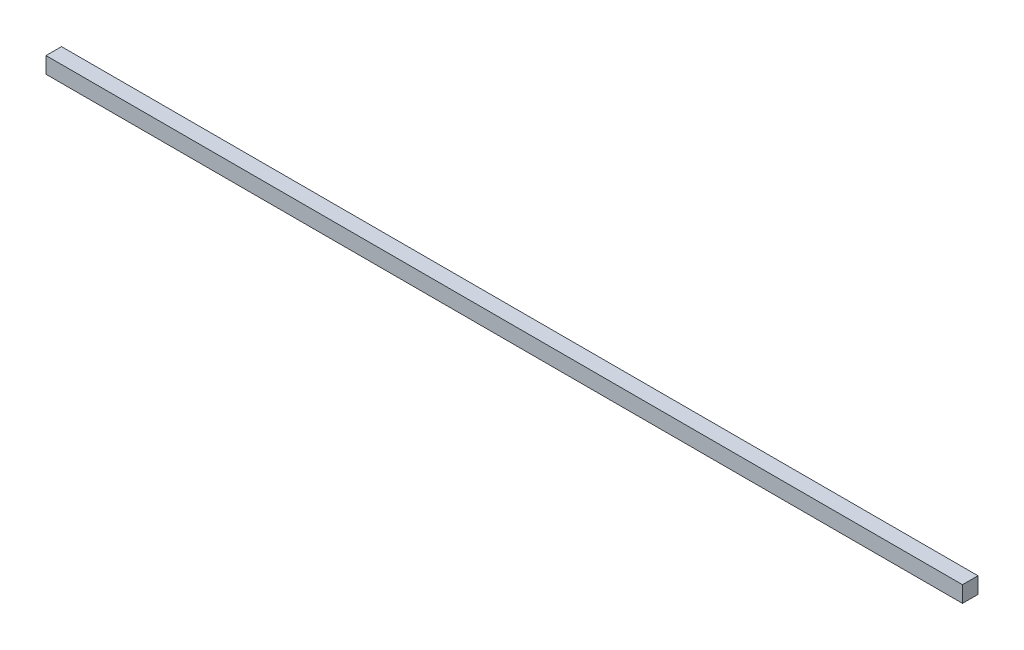
ISO-10303-21;
HEADER;
FILE_DESCRIPTION(('STEP AP214'),'2;1');
FILE_NAME('part.step','',(''),(''),'','','');
FILE_SCHEMA(('AUTOMOTIVE_DESIGN { 1 0 10303 214 1 1 1 1 }'));
ENDSEC;
DATA;
#1=APPLICATION_CONTEXT('core data for automotive mechanical design processes');
#2=APPLICATION_PROTOCOL_DEFINITION('international standard','automotive_design',2000,#1);
#3=PRODUCT_CONTEXT('',#1,'mechanical');
#4=PRODUCT('Part','Part','',(#3));
#5=PRODUCT_RELATED_PRODUCT_CATEGORY('part','',(#4));
#6=PRODUCT_DEFINITION_FORMATION('','',#4);
#7=PRODUCT_DEFINITION_CONTEXT('part definition',#1,'design');
#8=PRODUCT_DEFINITION('design','',#6,#7);
#9=PRODUCT_DEFINITION_SHAPE('','',#8);
#10=(LENGTH_UNIT() NAMED_UNIT(*) SI_UNIT(.MILLI.,.METRE.));
#11=(NAMED_UNIT(*) PLANE_ANGLE_UNIT() SI_UNIT($,.RADIAN.));
#12=(NAMED_UNIT(*) SI_UNIT($,.STERADIAN.) SOLID_ANGLE_UNIT());
#13=UNCERTAINTY_MEASURE_WITH_UNIT(LENGTH_MEASURE(1.E-05),#10,'distance_accuracy_value','');
#14=(GEOMETRIC_REPRESENTATION_CONTEXT(3) GLOBAL_UNCERTAINTY_ASSIGNED_CONTEXT((#13)) GLOBAL_UNIT_ASSIGNED_CONTEXT((#10,
#11,#12)) REPRESENTATION_CONTEXT('',''));
#15=CARTESIAN_POINT('',(0.,0.,0.));
#16=DIRECTION('',(0.,0.,1.));
#17=DIRECTION('',(1.,0.,0.));
#18=AXIS2_PLACEMENT_3D('',#15,#16,#17);
#19=CARTESIAN_POINT('',(-47.0387096774194,4.5258064516129,22.));
#20=DIRECTION('',(1.,0.,0.));
#21=DIRECTION('',(0.,0.,-1.));
#22=AXIS2_PLACEMENT_3D('',#19,#20,#21);
#23=PLANE('',#22);
#24=DIRECTION('',(0.,-1.,0.));
#25=VECTOR('',#24,1.);
#26=CARTESIAN_POINT('',(-47.0387096774194,4.5258064516129,0.));
#27=LINE('',#26,#25);
#28=CARTESIAN_POINT('',(-47.0387096774194,4.5258064516129,0.));
#29=VERTEX_POINT('',#28);
#30=CARTESIAN_POINT('',(-47.0387096774194,-18.4741935483871,0.));
#31=VERTEX_POINT('',#30);
#32=EDGE_CURVE('E113',#29,#31,#27,.T.);
#33=ORIENTED_EDGE('',*,*,#32,.T.);
#34=DIRECTION('',(0.,0.,-1.));
#35=VECTOR('',#34,1.);
#36=CARTESIAN_POINT('',(-47.0387096774194,-18.4741935483871,22.));
#37=LINE('',#36,#35);
#38=CARTESIAN_POINT('',(-47.0387096774194,-18.4741935483871,22.));
#39=VERTEX_POINT('',#38);
#40=EDGE_CURVE('E11',#39,#31,#37,.T.);
#41=ORIENTED_EDGE('',*,*,#40,.F.);
#42=DIRECTION('',(0.,-1.,0.));
#43=VECTOR('',#42,1.);
#44=CARTESIAN_POINT('',(-47.0387096774194,4.5258064516129,22.));
#45=LINE('',#44,#43);
#46=CARTESIAN_POINT('',(-47.0387096774194,4.5258064516129,22.));
#47=VERTEX_POINT('',#46);
#48=EDGE_CURVE('E97',#47,#39,#45,.T.);
#49=ORIENTED_EDGE('',*,*,#48,.F.);
#50=DIRECTION('',(0.,0.,-1.));
#51=VECTOR('',#50,1.);
#52=CARTESIAN_POINT('',(-47.0387096774194,4.5258064516129,22.));
#53=LINE('',#52,#51);
#54=EDGE_CURVE('E109',#47,#29,#53,.T.);
#55=ORIENTED_EDGE('',*,*,#54,.T.);
#56=EDGE_LOOP('',(#33,#41,#49,#55));
#57=FACE_BOUND('',#56,.T.);
#58=ADVANCED_FACE('F45',(#57),#23,.F.);
#59=CARTESIAN_POINT('',(-47.0387096774194,-18.4741935483871,22.));
#60=DIRECTION('',(0.,1.,0.));
#61=DIRECTION('',(-1.,0.,0.));
#62=AXIS2_PLACEMENT_3D('',#59,#60,#61);
#63=PLANE('',#62);
#64=DIRECTION('',(1.,0.,0.));
#65=VECTOR('',#64,1.);
#66=CARTESIAN_POINT('',(-47.0387096774194,-18.4741935483871,0.));
#67=LINE('',#66,#65);
#68=CARTESIAN_POINT('',(1252.96129032258,-18.4741935483871,0.));
#69=VERTEX_POINT('',#68);
#70=EDGE_CURVE('E102',#31,#69,#67,.T.);
#71=ORIENTED_EDGE('',*,*,#70,.T.);
#72=DIRECTION('',(0.,0.,-1.));
#73=VECTOR('',#72,1.);
#74=CARTESIAN_POINT('',(1252.96129032258,-18.4741935483871,22.));
#75=LINE('',#74,#73);
#76=CARTESIAN_POINT('',(1252.96129032258,-18.4741935483871,22.));
#77=VERTEX_POINT('',#76);
#78=EDGE_CURVE('E54',#77,#69,#75,.T.);
#79=ORIENTED_EDGE('',*,*,#78,.F.);
#80=DIRECTION('',(1.,0.,0.));
#81=VECTOR('',#80,1.);
#82=CARTESIAN_POINT('',(-47.0387096774194,-18.4741935483871,22.));
#83=LINE('',#82,#81);
#84=EDGE_CURVE('E92',#39,#77,#83,.T.);
#85=ORIENTED_EDGE('',*,*,#84,.F.);
#86=ORIENTED_EDGE('',*,*,#40,.T.);
#87=EDGE_LOOP('',(#71,#79,#85,#86));
#88=FACE_BOUND('',#87,.T.);
#89=ADVANCED_FACE('F101',(#88),#63,.F.);
#90=CARTESIAN_POINT('',(1252.96129032258,4.5258064516129,22.));
#91=DIRECTION('',(-1.,0.,0.));
#92=DIRECTION('',(0.,0.,1.));
#93=AXIS2_PLACEMENT_3D('',#90,#91,#92);
#94=PLANE('',#93);
#95=DIRECTION('',(0.,1.,0.));
#96=VECTOR('',#95,1.);
#97=CARTESIAN_POINT('',(1252.96129032258,4.5258064516129,0.));
#98=LINE('',#97,#96);
#99=CARTESIAN_POINT('',(1252.96129032258,4.5258064516129,0.));
#100=VERTEX_POINT('',#99);
#101=EDGE_CURVE('E79',#69,#100,#98,.T.);
#102=ORIENTED_EDGE('',*,*,#101,.T.);
#103=DIRECTION('',(0.,0.,-1.));
#104=VECTOR('',#103,1.);
#105=CARTESIAN_POINT('',(1252.96129032258,4.5258064516129,22.));
#106=LINE('',#105,#104);
#107=CARTESIAN_POINT('',(1252.96129032258,4.5258064516129,22.));
#108=VERTEX_POINT('',#107);
#109=EDGE_CURVE('E104',#108,#100,#106,.T.);
#110=ORIENTED_EDGE('',*,*,#109,.F.);
#111=DIRECTION('',(0.,1.,0.));
#112=VECTOR('',#111,1.);
#113=CARTESIAN_POINT('',(1252.96129032258,4.5258064516129,22.));
#114=LINE('',#113,#112);
#115=EDGE_CURVE('E95',#77,#108,#114,.T.);
#116=ORIENTED_EDGE('',*,*,#115,.F.);
#117=ORIENTED_EDGE('',*,*,#78,.T.);
#118=EDGE_LOOP('',(#102,#110,#116,#117));
#119=FACE_BOUND('',#118,.T.);
#120=ADVANCED_FACE('F105',(#119),#94,.F.);
#121=CARTESIAN_POINT('',(-47.0387096774194,4.5258064516129,22.));
#122=DIRECTION('',(0.,-1.,0.));
#123=DIRECTION('',(0.,0.,-1.));
#124=AXIS2_PLACEMENT_3D('',#121,#122,#123);
#125=PLANE('',#124);
#126=DIRECTION('',(-1.,0.,0.));
#127=VECTOR('',#126,1.);
#128=CARTESIAN_POINT('',(-47.0387096774194,4.5258064516129,0.));
#129=LINE('',#128,#127);
#130=EDGE_CURVE('E85',#100,#29,#129,.T.);
#131=ORIENTED_EDGE('',*,*,#130,.T.);
#132=ORIENTED_EDGE('',*,*,#54,.F.);
#133=DIRECTION('',(-1.,0.,0.));
#134=VECTOR('',#133,1.);
#135=CARTESIAN_POINT('',(-47.0387096774194,4.5258064516129,22.));
#136=LINE('',#135,#134);
#137=EDGE_CURVE('E62',#108,#47,#136,.T.);
#138=ORIENTED_EDGE('',*,*,#137,.F.);
#139=ORIENTED_EDGE('',*,*,#109,.T.);
#140=EDGE_LOOP('',(#131,#132,#138,#139));
#141=FACE_BOUND('',#140,.T.);
#142=ADVANCED_FACE('F126',(#141),#125,.F.);
#143=CARTESIAN_POINT('',(0.,0.,22.));
#144=DIRECTION('',(0.,0.,1.));
#145=DIRECTION('',(1.,0.,0.));
#146=AXIS2_PLACEMENT_3D('',#143,#144,#145);
#147=PLANE('',#146);
#148=ORIENTED_EDGE('',*,*,#48,.T.);
#149=ORIENTED_EDGE('',*,*,#84,.T.);
#150=ORIENTED_EDGE('',*,*,#115,.T.);
#151=ORIENTED_EDGE('',*,*,#137,.T.);
#152=EDGE_LOOP('',(#148,#149,#150,#151));
#153=FACE_BOUND('',#152,.T.);
#154=ADVANCED_FACE('F93',(#153),#147,.T.);
#155=CARTESIAN_POINT('',(0.,0.,0.));
#156=DIRECTION('',(0.,0.,1.));
#157=DIRECTION('',(1.,0.,0.));
#158=AXIS2_PLACEMENT_3D('',#155,#156,#157);
#159=PLANE('',#158);
#160=ORIENTED_EDGE('',*,*,#32,.F.);
#161=ORIENTED_EDGE('',*,*,#130,.F.);
#162=ORIENTED_EDGE('',*,*,#101,.F.);
#163=ORIENTED_EDGE('',*,*,#70,.F.);
#164=EDGE_LOOP('',(#160,#161,#162,#163));
#165=FACE_BOUND('',#164,.T.);
#166=ADVANCED_FACE('F129',(#165),#159,.F.);
#167=CLOSED_SHELL('',(#58,#89,#120,#142,#154,#166));
#168=MANIFOLD_SOLID_BREP('B2',#167);
#169=ADVANCED_BREP_SHAPE_REPRESENTATION('',(#18,#168),#14);
#170=SHAPE_DEFINITION_REPRESENTATION(#9,#169);
ENDSEC;
END-ISO-10303-21;
